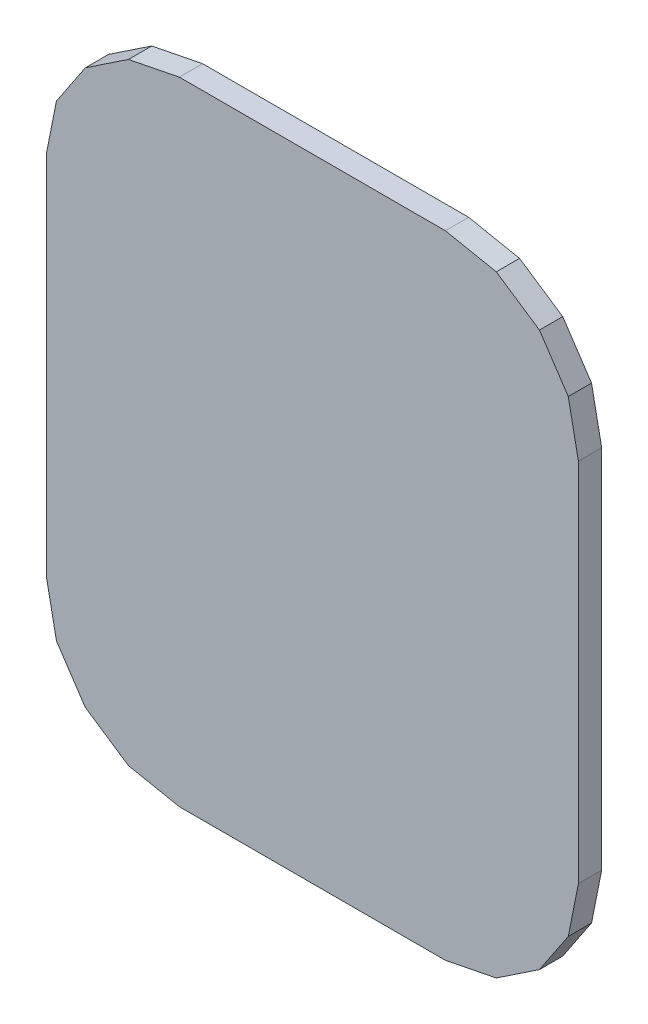
ISO-10303-21;
HEADER;
FILE_DESCRIPTION(('STEP AP214'),'2;1');
FILE_NAME('part.step','',(''),(''),'','','');
FILE_SCHEMA(('AUTOMOTIVE_DESIGN { 1 0 10303 214 1 1 1 1 }'));
ENDSEC;
DATA;
#1=APPLICATION_CONTEXT('core data for automotive mechanical design processes');
#2=APPLICATION_PROTOCOL_DEFINITION('international standard','automotive_design',2000,#1);
#3=PRODUCT_CONTEXT('',#1,'mechanical');
#4=PRODUCT('Part','Part','',(#3));
#5=PRODUCT_RELATED_PRODUCT_CATEGORY('part','',(#4));
#6=PRODUCT_DEFINITION_FORMATION('','',#4);
#7=PRODUCT_DEFINITION_CONTEXT('part definition',#1,'design');
#8=PRODUCT_DEFINITION('design','',#6,#7);
#9=PRODUCT_DEFINITION_SHAPE('','',#8);
#10=(LENGTH_UNIT() NAMED_UNIT(*) SI_UNIT(.MILLI.,.METRE.));
#11=(NAMED_UNIT(*) PLANE_ANGLE_UNIT() SI_UNIT($,.RADIAN.));
#12=(NAMED_UNIT(*) SI_UNIT($,.STERADIAN.) SOLID_ANGLE_UNIT());
#13=UNCERTAINTY_MEASURE_WITH_UNIT(LENGTH_MEASURE(1.E-05),#10,'distance_accuracy_value','');
#14=(GEOMETRIC_REPRESENTATION_CONTEXT(3) GLOBAL_UNCERTAINTY_ASSIGNED_CONTEXT((#13)) GLOBAL_UNIT_ASSIGNED_CONTEXT((#10,
#11,#12)) REPRESENTATION_CONTEXT('',''));
#15=CARTESIAN_POINT('',(0.,0.,0.));
#16=DIRECTION('',(0.,0.,1.));
#17=DIRECTION('',(1.,0.,0.));
#18=AXIS2_PLACEMENT_3D('',#15,#16,#17);
#19=CARTESIAN_POINT('',(96.805,-113.19,1.635));
#20=DIRECTION('',(0.,0.,-1.));
#21=DIRECTION('',(0.,-1.,0.));
#22=AXIS2_PLACEMENT_3D('',#19,#20,#21);
#23=PLANE('',#22);
#24=DIRECTION('',(0.980785662568049,-0.195088400734009,0.));
#25=VECTOR('',#24,1.);
#26=CARTESIAN_POINT('',(97.005,-112.715,1.635));
#27=LINE('',#26,#25);
#28=CARTESIAN_POINT('',(97.005,-112.715,1.635));
#29=VERTEX_POINT('',#28);
#30=CARTESIAN_POINT('',(97.081537,-112.730224,1.635));
#31=VERTEX_POINT('',#30);
#32=EDGE_CURVE('E25',#29,#31,#27,.T.);
#33=ORIENTED_EDGE('',*,*,#32,.F.);
#34=DIRECTION('',(1.,0.,0.));
#35=VECTOR('',#34,1.);
#36=CARTESIAN_POINT('',(96.605,-112.715,1.635));
#37=LINE('',#36,#35);
#38=CARTESIAN_POINT('',(96.605,-112.715,1.635));
#39=VERTEX_POINT('',#38);
#40=EDGE_CURVE('E239',#39,#29,#37,.T.);
#41=ORIENTED_EDGE('',*,*,#40,.F.);
#42=DIRECTION('',(0.980785662568049,0.195088400734009,0.));
#43=VECTOR('',#42,1.);
#44=CARTESIAN_POINT('',(96.528463,-112.730224,1.635));
#45=LINE('',#44,#43);
#46=CARTESIAN_POINT('',(96.528463,-112.730224,1.635));
#47=VERTEX_POINT('',#46);
#48=EDGE_CURVE('E262',#47,#39,#45,.T.);
#49=ORIENTED_EDGE('',*,*,#48,.F.);
#50=DIRECTION('',(0.83146430087319,0.555578182053127,0.));
#51=VECTOR('',#50,1.);
#52=CARTESIAN_POINT('',(96.463579,-112.773579,1.635));
#53=LINE('',#52,#51);
#54=CARTESIAN_POINT('',(96.463579,-112.773579,1.635));
#55=VERTEX_POINT('',#54);
#56=EDGE_CURVE('E280',#55,#47,#53,.T.);
#57=ORIENTED_EDGE('',*,*,#56,.F.);
#58=DIRECTION('',(0.555578182053127,0.83146430087319,0.));
#59=VECTOR('',#58,1.);
#60=CARTESIAN_POINT('',(96.420224,-112.838463,1.635));
#61=LINE('',#60,#59);
#62=CARTESIAN_POINT('',(96.420224,-112.838463,1.635));
#63=VERTEX_POINT('',#62);
#64=EDGE_CURVE('E330',#63,#55,#61,.T.);
#65=ORIENTED_EDGE('',*,*,#64,.F.);
#66=DIRECTION('',(0.195088400734009,0.980785662568049,0.));
#67=VECTOR('',#66,1.);
#68=CARTESIAN_POINT('',(96.405,-112.915,1.635));
#69=LINE('',#68,#67);
#70=CARTESIAN_POINT('',(96.405,-112.915,1.635));
#71=VERTEX_POINT('',#70);
#72=EDGE_CURVE('E321',#71,#63,#69,.T.);
#73=ORIENTED_EDGE('',*,*,#72,.F.);
#74=DIRECTION('',(0.,1.,0.));
#75=VECTOR('',#74,1.);
#76=CARTESIAN_POINT('',(96.405,-113.465,1.635));
#77=LINE('',#76,#75);
#78=CARTESIAN_POINT('',(96.405,-113.465,1.635));
#79=VERTEX_POINT('',#78);
#80=EDGE_CURVE('E309',#79,#71,#77,.T.);
#81=ORIENTED_EDGE('',*,*,#80,.F.);
#82=DIRECTION('',(-0.195088400734009,0.980785662568049,0.));
#83=VECTOR('',#82,1.);
#84=CARTESIAN_POINT('',(96.420224,-113.541537,1.635));
#85=LINE('',#84,#83);
#86=CARTESIAN_POINT('',(96.420224,-113.541537,1.635));
#87=VERTEX_POINT('',#86);
#88=EDGE_CURVE('E246',#87,#79,#85,.T.);
#89=ORIENTED_EDGE('',*,*,#88,.F.);
#90=DIRECTION('',(-0.555578182053127,0.83146430087319,0.));
#91=VECTOR('',#90,1.);
#92=CARTESIAN_POINT('',(96.463579,-113.606421,1.635));
#93=LINE('',#92,#91);
#94=CARTESIAN_POINT('',(96.463579,-113.606421,1.635));
#95=VERTEX_POINT('',#94);
#96=EDGE_CURVE('E294',#95,#87,#93,.T.);
#97=ORIENTED_EDGE('',*,*,#96,.F.);
#98=DIRECTION('',(-0.83146430087319,0.555578182053127,0.));
#99=VECTOR('',#98,1.);
#100=CARTESIAN_POINT('',(96.528463,-113.649776,1.635));
#101=LINE('',#100,#99);
#102=CARTESIAN_POINT('',(96.528463,-113.649776,1.635));
#103=VERTEX_POINT('',#102);
#104=EDGE_CURVE('E285',#103,#95,#101,.T.);
#105=ORIENTED_EDGE('',*,*,#104,.F.);
#106=DIRECTION('',(-0.980785662568049,0.195088400734009,0.));
#107=VECTOR('',#106,1.);
#108=CARTESIAN_POINT('',(96.605,-113.665,1.635));
#109=LINE('',#108,#107);
#110=CARTESIAN_POINT('',(96.605,-113.665,1.635));
#111=VERTEX_POINT('',#110);
#112=EDGE_CURVE('E257',#111,#103,#109,.T.);
#113=ORIENTED_EDGE('',*,*,#112,.F.);
#114=DIRECTION('',(-1.,0.,0.));
#115=VECTOR('',#114,1.);
#116=CARTESIAN_POINT('',(97.005,-113.665,1.635));
#117=LINE('',#116,#115);
#118=CARTESIAN_POINT('',(97.005,-113.665,1.635));
#119=VERTEX_POINT('',#118);
#120=EDGE_CURVE('E210',#119,#111,#117,.T.);
#121=ORIENTED_EDGE('',*,*,#120,.F.);
#122=DIRECTION('',(-0.980785662568049,-0.195088400734009,0.));
#123=VECTOR('',#122,1.);
#124=CARTESIAN_POINT('',(97.081537,-113.649776,1.635));
#125=LINE('',#124,#123);
#126=CARTESIAN_POINT('',(97.081537,-113.649776,1.635));
#127=VERTEX_POINT('',#126);
#128=EDGE_CURVE('E222',#127,#119,#125,.T.);
#129=ORIENTED_EDGE('',*,*,#128,.F.);
#130=DIRECTION('',(-0.83146430087319,-0.555578182053127,0.));
#131=VECTOR('',#130,1.);
#132=CARTESIAN_POINT('',(97.146421,-113.606421,1.635));
#133=LINE('',#132,#131);
#134=CARTESIAN_POINT('',(97.146421,-113.606421,1.635));
#135=VERTEX_POINT('',#134);
#136=EDGE_CURVE('E225',#135,#127,#133,.T.);
#137=ORIENTED_EDGE('',*,*,#136,.F.);
#138=DIRECTION('',(-0.555578182053127,-0.83146430087319,0.));
#139=VECTOR('',#138,1.);
#140=CARTESIAN_POINT('',(97.189776,-113.541537,1.635));
#141=LINE('',#140,#139);
#142=CARTESIAN_POINT('',(97.189776,-113.541537,1.635));
#143=VERTEX_POINT('',#142);
#144=EDGE_CURVE('E396',#143,#135,#141,.T.);
#145=ORIENTED_EDGE('',*,*,#144,.F.);
#146=DIRECTION('',(-0.195088400734009,-0.980785662568049,0.));
#147=VECTOR('',#146,1.);
#148=CARTESIAN_POINT('',(97.205,-113.465,1.635));
#149=LINE('',#148,#147);
#150=CARTESIAN_POINT('',(97.205,-113.465,1.635));
#151=VERTEX_POINT('',#150);
#152=EDGE_CURVE('E427',#151,#143,#149,.T.);
#153=ORIENTED_EDGE('',*,*,#152,.F.);
#154=DIRECTION('',(0.,-1.,0.));
#155=VECTOR('',#154,1.);
#156=CARTESIAN_POINT('',(97.205,-112.915,1.635));
#157=LINE('',#156,#155);
#158=CARTESIAN_POINT('',(97.205,-112.915,1.635));
#159=VERTEX_POINT('',#158);
#160=EDGE_CURVE('E388',#159,#151,#157,.T.);
#161=ORIENTED_EDGE('',*,*,#160,.F.);
#162=DIRECTION('',(0.195088400734009,-0.980785662568049,0.));
#163=VECTOR('',#162,1.);
#164=CARTESIAN_POINT('',(97.189776,-112.838463,1.635));
#165=LINE('',#164,#163);
#166=CARTESIAN_POINT('',(97.189776,-112.838463,1.635));
#167=VERTEX_POINT('',#166);
#168=EDGE_CURVE('E376',#167,#159,#165,.T.);
#169=ORIENTED_EDGE('',*,*,#168,.F.);
#170=DIRECTION('',(0.555578182053127,-0.83146430087319,0.));
#171=VECTOR('',#170,1.);
#172=CARTESIAN_POINT('',(97.146421,-112.773579,1.635));
#173=LINE('',#172,#171);
#174=CARTESIAN_POINT('',(97.146421,-112.773579,1.635));
#175=VERTEX_POINT('',#174);
#176=EDGE_CURVE('E476',#175,#167,#173,.T.);
#177=ORIENTED_EDGE('',*,*,#176,.F.);
#178=DIRECTION('',(0.83146430087319,-0.555578182053127,0.));
#179=VECTOR('',#178,1.);
#180=CARTESIAN_POINT('',(97.081537,-112.730224,1.635));
#181=LINE('',#180,#179);
#182=EDGE_CURVE('E492',#31,#175,#181,.T.);
#183=ORIENTED_EDGE('',*,*,#182,.F.);
#184=EDGE_LOOP('',(#33,#41,#49,#57,#65,#73,#81,#89,#97,#105,#113,#121,#129,#137,#145,#153,#161,
#169,#177,#183));
#185=FACE_BOUND('',#184,.T.);
#186=ADVANCED_FACE('F17',(#185),#23,.F.);
#187=CARTESIAN_POINT('',(96.805,-113.19,1.6));
#188=DIRECTION('',(0.,0.,-1.));
#189=DIRECTION('',(0.,-1.,0.));
#190=AXIS2_PLACEMENT_3D('',#187,#188,#189);
#191=PLANE('',#190);
#192=DIRECTION('',(0.83146430087319,-0.555578182053127,0.));
#193=VECTOR('',#192,1.);
#194=CARTESIAN_POINT('',(97.081537,-112.730224,1.6));
#195=LINE('',#194,#193);
#196=CARTESIAN_POINT('',(97.081537,-112.730224,1.6));
#197=VERTEX_POINT('',#196);
#198=CARTESIAN_POINT('',(97.146421,-112.773579,1.6));
#199=VERTEX_POINT('',#198);
#200=EDGE_CURVE('E481',#197,#199,#195,.T.);
#201=ORIENTED_EDGE('',*,*,#200,.T.);
#202=DIRECTION('',(0.555578182053127,-0.83146430087319,0.));
#203=VECTOR('',#202,1.);
#204=CARTESIAN_POINT('',(97.146421,-112.773579,1.6));
#205=LINE('',#204,#203);
#206=CARTESIAN_POINT('',(97.189776,-112.838463,1.6));
#207=VERTEX_POINT('',#206);
#208=EDGE_CURVE('E372',#199,#207,#205,.T.);
#209=ORIENTED_EDGE('',*,*,#208,.T.);
#210=DIRECTION('',(0.195088400734009,-0.980785662568049,0.));
#211=VECTOR('',#210,1.);
#212=CARTESIAN_POINT('',(97.189776,-112.838463,1.6));
#213=LINE('',#212,#211);
#214=CARTESIAN_POINT('',(97.205,-112.915,1.6));
#215=VERTEX_POINT('',#214);
#216=EDGE_CURVE('E367',#207,#215,#213,.T.);
#217=ORIENTED_EDGE('',*,*,#216,.T.);
#218=DIRECTION('',(0.,-1.,0.));
#219=VECTOR('',#218,1.);
#220=CARTESIAN_POINT('',(97.205,-112.915,1.6));
#221=LINE('',#220,#219);
#222=CARTESIAN_POINT('',(97.205,-113.465,1.6));
#223=VERTEX_POINT('',#222);
#224=EDGE_CURVE('E436',#215,#223,#221,.T.);
#225=ORIENTED_EDGE('',*,*,#224,.T.);
#226=DIRECTION('',(-0.195088400734009,-0.980785662568049,0.));
#227=VECTOR('',#226,1.);
#228=CARTESIAN_POINT('',(97.205,-113.465,1.6));
#229=LINE('',#228,#227);
#230=CARTESIAN_POINT('',(97.189776,-113.541537,1.6));
#231=VERTEX_POINT('',#230);
#232=EDGE_CURVE('E393',#223,#231,#229,.T.);
#233=ORIENTED_EDGE('',*,*,#232,.T.);
#234=DIRECTION('',(-0.555578182053127,-0.83146430087319,0.));
#235=VECTOR('',#234,1.);
#236=CARTESIAN_POINT('',(97.189776,-113.541537,1.6));
#237=LINE('',#236,#235);
#238=CARTESIAN_POINT('',(97.146421,-113.606421,1.6));
#239=VERTEX_POINT('',#238);
#240=EDGE_CURVE('E217',#231,#239,#237,.T.);
#241=ORIENTED_EDGE('',*,*,#240,.T.);
#242=DIRECTION('',(-0.83146430087319,-0.555578182053127,0.));
#243=VECTOR('',#242,1.);
#244=CARTESIAN_POINT('',(97.146421,-113.606421,1.6));
#245=LINE('',#244,#243);
#246=CARTESIAN_POINT('',(97.081537,-113.649776,1.6));
#247=VERTEX_POINT('',#246);
#248=EDGE_CURVE('E213',#239,#247,#245,.T.);
#249=ORIENTED_EDGE('',*,*,#248,.T.);
#250=DIRECTION('',(-0.980785662568049,-0.195088400734009,0.));
#251=VECTOR('',#250,1.);
#252=CARTESIAN_POINT('',(97.081537,-113.649776,1.6));
#253=LINE('',#252,#251);
#254=CARTESIAN_POINT('',(97.005,-113.665,1.6));
#255=VERTEX_POINT('',#254);
#256=EDGE_CURVE('E198',#247,#255,#253,.T.);
#257=ORIENTED_EDGE('',*,*,#256,.T.);
#258=DIRECTION('',(-1.,0.,0.));
#259=VECTOR('',#258,1.);
#260=CARTESIAN_POINT('',(97.005,-113.665,1.6));
#261=LINE('',#260,#259);
#262=CARTESIAN_POINT('',(96.605,-113.665,1.6));
#263=VERTEX_POINT('',#262);
#264=EDGE_CURVE('E270',#255,#263,#261,.T.);
#265=ORIENTED_EDGE('',*,*,#264,.T.);
#266=DIRECTION('',(-0.980785662568049,0.195088400734009,0.));
#267=VECTOR('',#266,1.);
#268=CARTESIAN_POINT('',(96.605,-113.665,1.6));
#269=LINE('',#268,#267);
#270=CARTESIAN_POINT('',(96.528463,-113.649776,1.6));
#271=VERTEX_POINT('',#270);
#272=EDGE_CURVE('E256',#263,#271,#269,.T.);
#273=ORIENTED_EDGE('',*,*,#272,.T.);
#274=DIRECTION('',(-0.83146430087319,0.555578182053127,0.));
#275=VECTOR('',#274,1.);
#276=CARTESIAN_POINT('',(96.528463,-113.649776,1.6));
#277=LINE('',#276,#275);
#278=CARTESIAN_POINT('',(96.463579,-113.606421,1.6));
#279=VERTEX_POINT('',#278);
#280=EDGE_CURVE('E290',#271,#279,#277,.T.);
#281=ORIENTED_EDGE('',*,*,#280,.T.);
#282=DIRECTION('',(-0.555578182053127,0.83146430087319,0.));
#283=VECTOR('',#282,1.);
#284=CARTESIAN_POINT('',(96.463579,-113.606421,1.6));
#285=LINE('',#284,#283);
#286=CARTESIAN_POINT('',(96.420224,-113.541537,1.6));
#287=VERTEX_POINT('',#286);
#288=EDGE_CURVE('E251',#279,#287,#285,.T.);
#289=ORIENTED_EDGE('',*,*,#288,.T.);
#290=DIRECTION('',(-0.195088400734009,0.980785662568049,0.));
#291=VECTOR('',#290,1.);
#292=CARTESIAN_POINT('',(96.420224,-113.541537,1.6));
#293=LINE('',#292,#291);
#294=CARTESIAN_POINT('',(96.405,-113.465,1.6));
#295=VERTEX_POINT('',#294);
#296=EDGE_CURVE('E305',#287,#295,#293,.T.);
#297=ORIENTED_EDGE('',*,*,#296,.T.);
#298=DIRECTION('',(0.,1.,0.));
#299=VECTOR('',#298,1.);
#300=CARTESIAN_POINT('',(96.405,-113.465,1.6));
#301=LINE('',#300,#299);
#302=CARTESIAN_POINT('',(96.405,-112.915,1.6));
#303=VERTEX_POINT('',#302);
#304=EDGE_CURVE('E317',#295,#303,#301,.T.);
#305=ORIENTED_EDGE('',*,*,#304,.T.);
#306=DIRECTION('',(0.195088400734009,0.980785662568049,0.));
#307=VECTOR('',#306,1.);
#308=CARTESIAN_POINT('',(96.405,-112.915,1.6));
#309=LINE('',#308,#307);
#310=CARTESIAN_POINT('',(96.420224,-112.838463,1.6));
#311=VERTEX_POINT('',#310);
#312=EDGE_CURVE('E326',#303,#311,#309,.T.);
#313=ORIENTED_EDGE('',*,*,#312,.T.);
#314=DIRECTION('',(0.555578182053127,0.83146430087319,0.));
#315=VECTOR('',#314,1.);
#316=CARTESIAN_POINT('',(96.420224,-112.838463,1.6));
#317=LINE('',#316,#315);
#318=CARTESIAN_POINT('',(96.463579,-112.773579,1.6));
#319=VERTEX_POINT('',#318);
#320=EDGE_CURVE('E276',#311,#319,#317,.T.);
#321=ORIENTED_EDGE('',*,*,#320,.T.);
#322=DIRECTION('',(0.83146430087319,0.555578182053127,0.));
#323=VECTOR('',#322,1.);
#324=CARTESIAN_POINT('',(96.463579,-112.773579,1.6));
#325=LINE('',#324,#323);
#326=CARTESIAN_POINT('',(96.528463,-112.730224,1.6));
#327=VERTEX_POINT('',#326);
#328=EDGE_CURVE('E266',#319,#327,#325,.T.);
#329=ORIENTED_EDGE('',*,*,#328,.T.);
#330=DIRECTION('',(0.980785662568049,0.195088400734009,0.));
#331=VECTOR('',#330,1.);
#332=CARTESIAN_POINT('',(96.528463,-112.730224,1.6));
#333=LINE('',#332,#331);
#334=CARTESIAN_POINT('',(96.605,-112.715,1.6));
#335=VERTEX_POINT('',#334);
#336=EDGE_CURVE('E236',#327,#335,#333,.T.);
#337=ORIENTED_EDGE('',*,*,#336,.T.);
#338=DIRECTION('',(1.,0.,0.));
#339=VECTOR('',#338,1.);
#340=CARTESIAN_POINT('',(96.605,-112.715,1.6));
#341=LINE('',#340,#339);
#342=CARTESIAN_POINT('',(97.005,-112.715,1.6));
#343=VERTEX_POINT('',#342);
#344=EDGE_CURVE('E349',#335,#343,#341,.T.);
#345=ORIENTED_EDGE('',*,*,#344,.T.);
#346=DIRECTION('',(0.980785662568049,-0.195088400734009,0.));
#347=VECTOR('',#346,1.);
#348=CARTESIAN_POINT('',(97.005,-112.715,1.6));
#349=LINE('',#348,#347);
#350=EDGE_CURVE('E11',#343,#197,#349,.T.);
#351=ORIENTED_EDGE('',*,*,#350,.T.);
#352=EDGE_LOOP('',(#201,#209,#217,#225,#233,#241,#249,#257,#265,#273,#281,#289,#297,#305,#313,
#321,#329,#337,#345,#351));
#353=FACE_BOUND('',#352,.T.);
#354=ADVANCED_FACE('F215',(#353),#191,.T.);
#355=CARTESIAN_POINT('',(97.005,-112.715,1.6));
#356=DIRECTION('',(0.195088400734009,0.980785662568049,0.));
#357=DIRECTION('',(0.,0.,-1.));
#358=AXIS2_PLACEMENT_3D('',#355,#356,#357);
#359=PLANE('',#358);
#360=DIRECTION('',(0.,0.,1.));
#361=VECTOR('',#360,1.);
#362=CARTESIAN_POINT('',(97.005,-112.715,1.6));
#363=LINE('',#362,#361);
#364=EDGE_CURVE('E235',#343,#29,#363,.T.);
#365=ORIENTED_EDGE('',*,*,#364,.T.);
#366=ORIENTED_EDGE('',*,*,#32,.T.);
#367=DIRECTION('',(0.,0.,1.));
#368=VECTOR('',#367,1.);
#369=CARTESIAN_POINT('',(97.081537,-112.730224,1.6));
#370=LINE('',#369,#368);
#371=EDGE_CURVE('E499',#197,#31,#370,.T.);
#372=ORIENTED_EDGE('',*,*,#371,.F.);
#373=ORIENTED_EDGE('',*,*,#350,.F.);
#374=EDGE_LOOP('',(#365,#366,#372,#373));
#375=FACE_BOUND('',#374,.T.);
#376=ADVANCED_FACE('F542',(#375),#359,.T.);
#377=CARTESIAN_POINT('',(96.605,-112.715,1.6));
#378=DIRECTION('',(0.,1.,0.));
#379=DIRECTION('',(1.,0.,0.));
#380=AXIS2_PLACEMENT_3D('',#377,#378,#379);
#381=PLANE('',#380);
#382=DIRECTION('',(0.,0.,1.));
#383=VECTOR('',#382,1.);
#384=CARTESIAN_POINT('',(96.605,-112.715,1.6));
#385=LINE('',#384,#383);
#386=EDGE_CURVE('E240',#335,#39,#385,.T.);
#387=ORIENTED_EDGE('',*,*,#386,.T.);
#388=ORIENTED_EDGE('',*,*,#40,.T.);
#389=ORIENTED_EDGE('',*,*,#364,.F.);
#390=ORIENTED_EDGE('',*,*,#344,.F.);
#391=EDGE_LOOP('',(#387,#388,#389,#390));
#392=FACE_BOUND('',#391,.T.);
#393=ADVANCED_FACE('F544',(#392),#381,.T.);
#394=CARTESIAN_POINT('',(96.528463,-112.730224,1.6));
#395=DIRECTION('',(-0.195088400734009,0.980785662568049,0.));
#396=DIRECTION('',(0.,0.,1.));
#397=AXIS2_PLACEMENT_3D('',#394,#395,#396);
#398=PLANE('',#397);
#399=DIRECTION('',(0.,0.,1.));
#400=VECTOR('',#399,1.);
#401=CARTESIAN_POINT('',(96.528463,-112.730224,1.6));
#402=LINE('',#401,#400);
#403=EDGE_CURVE('E340',#327,#47,#402,.T.);
#404=ORIENTED_EDGE('',*,*,#403,.T.);
#405=ORIENTED_EDGE('',*,*,#48,.T.);
#406=ORIENTED_EDGE('',*,*,#386,.F.);
#407=ORIENTED_EDGE('',*,*,#336,.F.);
#408=EDGE_LOOP('',(#404,#405,#406,#407));
#409=FACE_BOUND('',#408,.T.);
#410=ADVANCED_FACE('F552',(#409),#398,.T.);
#411=CARTESIAN_POINT('',(96.463579,-112.773579,1.6));
#412=DIRECTION('',(-0.555578182053127,0.83146430087319,0.));
#413=DIRECTION('',(0.,0.,1.));
#414=AXIS2_PLACEMENT_3D('',#411,#412,#413);
#415=PLANE('',#414);
#416=DIRECTION('',(0.,0.,1.));
#417=VECTOR('',#416,1.);
#418=CARTESIAN_POINT('',(96.463579,-112.773579,1.6));
#419=LINE('',#418,#417);
#420=EDGE_CURVE('E281',#319,#55,#419,.T.);
#421=ORIENTED_EDGE('',*,*,#420,.T.);
#422=ORIENTED_EDGE('',*,*,#56,.T.);
#423=ORIENTED_EDGE('',*,*,#403,.F.);
#424=ORIENTED_EDGE('',*,*,#328,.F.);
#425=EDGE_LOOP('',(#421,#422,#423,#424));
#426=FACE_BOUND('',#425,.T.);
#427=ADVANCED_FACE('F594',(#426),#415,.T.);
#428=CARTESIAN_POINT('',(96.420224,-112.838463,1.6));
#429=DIRECTION('',(-0.83146430087319,0.555578182053127,0.));
#430=DIRECTION('',(0.,0.,1.));
#431=AXIS2_PLACEMENT_3D('',#428,#429,#430);
#432=PLANE('',#431);
#433=DIRECTION('',(0.,0.,1.));
#434=VECTOR('',#433,1.);
#435=CARTESIAN_POINT('',(96.420224,-112.838463,1.6));
#436=LINE('',#435,#434);
#437=EDGE_CURVE('E325',#311,#63,#436,.T.);
#438=ORIENTED_EDGE('',*,*,#437,.T.);
#439=ORIENTED_EDGE('',*,*,#64,.T.);
#440=ORIENTED_EDGE('',*,*,#420,.F.);
#441=ORIENTED_EDGE('',*,*,#320,.F.);
#442=EDGE_LOOP('',(#438,#439,#440,#441));
#443=FACE_BOUND('',#442,.T.);
#444=ADVANCED_FACE('F601',(#443),#432,.T.);
#445=CARTESIAN_POINT('',(96.405,-112.915,1.6));
#446=DIRECTION('',(-0.980785662568049,0.195088400734009,0.));
#447=DIRECTION('',(0.,0.,1.));
#448=AXIS2_PLACEMENT_3D('',#445,#446,#447);
#449=PLANE('',#448);
#450=DIRECTION('',(0.,0.,1.));
#451=VECTOR('',#450,1.);
#452=CARTESIAN_POINT('',(96.405,-112.915,1.6));
#453=LINE('',#452,#451);
#454=EDGE_CURVE('E313',#303,#71,#453,.T.);
#455=ORIENTED_EDGE('',*,*,#454,.T.);
#456=ORIENTED_EDGE('',*,*,#72,.T.);
#457=ORIENTED_EDGE('',*,*,#437,.F.);
#458=ORIENTED_EDGE('',*,*,#312,.F.);
#459=EDGE_LOOP('',(#455,#456,#457,#458));
#460=FACE_BOUND('',#459,.T.);
#461=ADVANCED_FACE('F610',(#460),#449,.T.);
#462=CARTESIAN_POINT('',(96.405,-113.465,1.6));
#463=DIRECTION('',(-1.,0.,0.));
#464=DIRECTION('',(0.,0.,1.));
#465=AXIS2_PLACEMENT_3D('',#462,#463,#464);
#466=PLANE('',#465);
#467=DIRECTION('',(0.,0.,1.));
#468=VECTOR('',#467,1.);
#469=CARTESIAN_POINT('',(96.405,-113.465,1.6));
#470=LINE('',#469,#468);
#471=EDGE_CURVE('E250',#295,#79,#470,.T.);
#472=ORIENTED_EDGE('',*,*,#471,.T.);
#473=ORIENTED_EDGE('',*,*,#80,.T.);
#474=ORIENTED_EDGE('',*,*,#454,.F.);
#475=ORIENTED_EDGE('',*,*,#304,.F.);
#476=EDGE_LOOP('',(#472,#473,#474,#475));
#477=FACE_BOUND('',#476,.T.);
#478=ADVANCED_FACE('F625',(#477),#466,.T.);
#479=CARTESIAN_POINT('',(96.420224,-113.541537,1.6));
#480=DIRECTION('',(-0.980785662568049,-0.195088400734009,0.));
#481=DIRECTION('',(-0.195088400734009,0.980785662568049,0.));
#482=AXIS2_PLACEMENT_3D('',#479,#480,#481);
#483=PLANE('',#482);
#484=DIRECTION('',(0.,0.,1.));
#485=VECTOR('',#484,1.);
#486=CARTESIAN_POINT('',(96.420224,-113.541537,1.6));
#487=LINE('',#486,#485);
#488=EDGE_CURVE('E298',#287,#87,#487,.T.);
#489=ORIENTED_EDGE('',*,*,#488,.T.);
#490=ORIENTED_EDGE('',*,*,#88,.T.);
#491=ORIENTED_EDGE('',*,*,#471,.F.);
#492=ORIENTED_EDGE('',*,*,#296,.F.);
#493=EDGE_LOOP('',(#489,#490,#491,#492));
#494=FACE_BOUND('',#493,.T.);
#495=ADVANCED_FACE('F630',(#494),#483,.T.);
#496=CARTESIAN_POINT('',(96.463579,-113.606421,1.6));
#497=DIRECTION('',(-0.83146430087319,-0.555578182053127,0.));
#498=DIRECTION('',(-0.555578182053127,0.83146430087319,0.));
#499=AXIS2_PLACEMENT_3D('',#496,#497,#498);
#500=PLANE('',#499);
#501=DIRECTION('',(0.,0.,1.));
#502=VECTOR('',#501,1.);
#503=CARTESIAN_POINT('',(96.463579,-113.606421,1.6));
#504=LINE('',#503,#502);
#505=EDGE_CURVE('E286',#279,#95,#504,.T.);
#506=ORIENTED_EDGE('',*,*,#505,.T.);
#507=ORIENTED_EDGE('',*,*,#96,.T.);
#508=ORIENTED_EDGE('',*,*,#488,.F.);
#509=ORIENTED_EDGE('',*,*,#288,.F.);
#510=EDGE_LOOP('',(#506,#507,#508,#509));
#511=FACE_BOUND('',#510,.T.);
#512=ADVANCED_FACE('F520',(#511),#500,.T.);
#513=CARTESIAN_POINT('',(96.528463,-113.649776,1.6));
#514=DIRECTION('',(-0.555578182053127,-0.83146430087319,0.));
#515=DIRECTION('',(-0.83146430087319,0.555578182053127,0.));
#516=AXIS2_PLACEMENT_3D('',#513,#514,#515);
#517=PLANE('',#516);
#518=DIRECTION('',(0.,0.,1.));
#519=VECTOR('',#518,1.);
#520=CARTESIAN_POINT('',(96.528463,-113.649776,1.6));
#521=LINE('',#520,#519);
#522=EDGE_CURVE('E252',#271,#103,#521,.T.);
#523=ORIENTED_EDGE('',*,*,#522,.T.);
#524=ORIENTED_EDGE('',*,*,#104,.T.);
#525=ORIENTED_EDGE('',*,*,#505,.F.);
#526=ORIENTED_EDGE('',*,*,#280,.F.);
#527=EDGE_LOOP('',(#523,#524,#525,#526));
#528=FACE_BOUND('',#527,.T.);
#529=ADVANCED_FACE('F516',(#528),#517,.T.);
#530=CARTESIAN_POINT('',(96.605,-113.665,1.6));
#531=DIRECTION('',(-0.195088400734009,-0.980785662568049,0.));
#532=DIRECTION('',(-0.980785662568049,0.195088400734009,0.));
#533=AXIS2_PLACEMENT_3D('',#530,#531,#532);
#534=PLANE('',#533);
#535=DIRECTION('',(0.,0.,1.));
#536=VECTOR('',#535,1.);
#537=CARTESIAN_POINT('',(96.605,-113.665,1.6));
#538=LINE('',#537,#536);
#539=EDGE_CURVE('E261',#263,#111,#538,.T.);
#540=ORIENTED_EDGE('',*,*,#539,.T.);
#541=ORIENTED_EDGE('',*,*,#112,.T.);
#542=ORIENTED_EDGE('',*,*,#522,.F.);
#543=ORIENTED_EDGE('',*,*,#272,.F.);
#544=EDGE_LOOP('',(#540,#541,#542,#543));
#545=FACE_BOUND('',#544,.T.);
#546=ADVANCED_FACE('F523',(#545),#534,.T.);
#547=CARTESIAN_POINT('',(97.005,-113.665,1.6));
#548=DIRECTION('',(0.,-1.,0.));
#549=DIRECTION('',(0.,0.,-1.));
#550=AXIS2_PLACEMENT_3D('',#547,#548,#549);
#551=PLANE('',#550);
#552=DIRECTION('',(0.,0.,1.));
#553=VECTOR('',#552,1.);
#554=CARTESIAN_POINT('',(97.005,-113.665,1.6));
#555=LINE('',#554,#553);
#556=EDGE_CURVE('E206',#255,#119,#555,.T.);
#557=ORIENTED_EDGE('',*,*,#556,.T.);
#558=ORIENTED_EDGE('',*,*,#120,.T.);
#559=ORIENTED_EDGE('',*,*,#539,.F.);
#560=ORIENTED_EDGE('',*,*,#264,.F.);
#561=EDGE_LOOP('',(#557,#558,#559,#560));
#562=FACE_BOUND('',#561,.T.);
#563=ADVANCED_FACE('F525',(#562),#551,.T.);
#564=CARTESIAN_POINT('',(97.081537,-113.649776,1.6));
#565=DIRECTION('',(0.195088400734009,-0.980785662568049,0.));
#566=DIRECTION('',(0.,0.,-1.));
#567=AXIS2_PLACEMENT_3D('',#564,#565,#566);
#568=PLANE('',#567);
#569=DIRECTION('',(0.,0.,1.));
#570=VECTOR('',#569,1.);
#571=CARTESIAN_POINT('',(97.081537,-113.649776,1.6));
#572=LINE('',#571,#570);
#573=EDGE_CURVE('E203',#247,#127,#572,.T.);
#574=ORIENTED_EDGE('',*,*,#573,.T.);
#575=ORIENTED_EDGE('',*,*,#128,.T.);
#576=ORIENTED_EDGE('',*,*,#556,.F.);
#577=ORIENTED_EDGE('',*,*,#256,.F.);
#578=EDGE_LOOP('',(#574,#575,#576,#577));
#579=FACE_BOUND('',#578,.T.);
#580=ADVANCED_FACE('F200',(#579),#568,.T.);
#581=CARTESIAN_POINT('',(97.146421,-113.606421,1.6));
#582=DIRECTION('',(0.555578182053127,-0.83146430087319,0.));
#583=DIRECTION('',(0.,0.,-1.));
#584=AXIS2_PLACEMENT_3D('',#581,#582,#583);
#585=PLANE('',#584);
#586=DIRECTION('',(0.,0.,1.));
#587=VECTOR('',#586,1.);
#588=CARTESIAN_POINT('',(97.146421,-113.606421,1.6));
#589=LINE('',#588,#587);
#590=EDGE_CURVE('E401',#239,#135,#589,.T.);
#591=ORIENTED_EDGE('',*,*,#590,.T.);
#592=ORIENTED_EDGE('',*,*,#136,.T.);
#593=ORIENTED_EDGE('',*,*,#573,.F.);
#594=ORIENTED_EDGE('',*,*,#248,.F.);
#595=EDGE_LOOP('',(#591,#592,#593,#594));
#596=FACE_BOUND('',#595,.T.);
#597=ADVANCED_FACE('F224',(#596),#585,.T.);
#598=CARTESIAN_POINT('',(97.189776,-113.541537,1.6));
#599=DIRECTION('',(0.83146430087319,-0.555578182053127,0.));
#600=DIRECTION('',(0.,0.,-1.));
#601=AXIS2_PLACEMENT_3D('',#598,#599,#600);
#602=PLANE('',#601);
#603=DIRECTION('',(0.,0.,1.));
#604=VECTOR('',#603,1.);
#605=CARTESIAN_POINT('',(97.189776,-113.541537,1.6));
#606=LINE('',#605,#604);
#607=EDGE_CURVE('E397',#231,#143,#606,.T.);
#608=ORIENTED_EDGE('',*,*,#607,.T.);
#609=ORIENTED_EDGE('',*,*,#144,.T.);
#610=ORIENTED_EDGE('',*,*,#590,.F.);
#611=ORIENTED_EDGE('',*,*,#240,.F.);
#612=EDGE_LOOP('',(#608,#609,#610,#611));
#613=FACE_BOUND('',#612,.T.);
#614=ADVANCED_FACE('F527',(#613),#602,.T.);
#615=CARTESIAN_POINT('',(97.205,-113.465,1.6));
#616=DIRECTION('',(0.980785662568049,-0.195088400734009,0.));
#617=DIRECTION('',(0.,0.,-1.));
#618=AXIS2_PLACEMENT_3D('',#615,#616,#617);
#619=PLANE('',#618);
#620=DIRECTION('',(0.,0.,1.));
#621=VECTOR('',#620,1.);
#622=CARTESIAN_POINT('',(97.205,-113.465,1.6));
#623=LINE('',#622,#621);
#624=EDGE_CURVE('E392',#223,#151,#623,.T.);
#625=ORIENTED_EDGE('',*,*,#624,.T.);
#626=ORIENTED_EDGE('',*,*,#152,.T.);
#627=ORIENTED_EDGE('',*,*,#607,.F.);
#628=ORIENTED_EDGE('',*,*,#232,.F.);
#629=EDGE_LOOP('',(#625,#626,#627,#628));
#630=FACE_BOUND('',#629,.T.);
#631=ADVANCED_FACE('F530',(#630),#619,.T.);
#632=CARTESIAN_POINT('',(97.205,-112.915,1.6));
#633=DIRECTION('',(1.,0.,0.));
#634=DIRECTION('',(0.,1.,0.));
#635=AXIS2_PLACEMENT_3D('',#632,#633,#634);
#636=PLANE('',#635);
#637=DIRECTION('',(0.,0.,1.));
#638=VECTOR('',#637,1.);
#639=CARTESIAN_POINT('',(97.205,-112.915,1.6));
#640=LINE('',#639,#638);
#641=EDGE_CURVE('E381',#215,#159,#640,.T.);
#642=ORIENTED_EDGE('',*,*,#641,.T.);
#643=ORIENTED_EDGE('',*,*,#160,.T.);
#644=ORIENTED_EDGE('',*,*,#624,.F.);
#645=ORIENTED_EDGE('',*,*,#224,.F.);
#646=EDGE_LOOP('',(#642,#643,#644,#645));
#647=FACE_BOUND('',#646,.T.);
#648=ADVANCED_FACE('F534',(#647),#636,.T.);
#649=CARTESIAN_POINT('',(97.189776,-112.838463,1.6));
#650=DIRECTION('',(0.980785662568049,0.195088400734009,0.));
#651=DIRECTION('',(0.,0.,-1.));
#652=AXIS2_PLACEMENT_3D('',#649,#650,#651);
#653=PLANE('',#652);
#654=DIRECTION('',(0.,0.,1.));
#655=VECTOR('',#654,1.);
#656=CARTESIAN_POINT('',(97.189776,-112.838463,1.6));
#657=LINE('',#656,#655);
#658=EDGE_CURVE('E377',#207,#167,#657,.T.);
#659=ORIENTED_EDGE('',*,*,#658,.T.);
#660=ORIENTED_EDGE('',*,*,#168,.T.);
#661=ORIENTED_EDGE('',*,*,#641,.F.);
#662=ORIENTED_EDGE('',*,*,#216,.F.);
#663=EDGE_LOOP('',(#659,#660,#661,#662));
#664=FACE_BOUND('',#663,.T.);
#665=ADVANCED_FACE('F536',(#664),#653,.T.);
#666=CARTESIAN_POINT('',(97.146421,-112.773579,1.6));
#667=DIRECTION('',(0.83146430087319,0.555578182053127,0.));
#668=DIRECTION('',(0.,0.,-1.));
#669=AXIS2_PLACEMENT_3D('',#666,#667,#668);
#670=PLANE('',#669);
#671=DIRECTION('',(0.,0.,1.));
#672=VECTOR('',#671,1.);
#673=CARTESIAN_POINT('',(97.146421,-112.773579,1.6));
#674=LINE('',#673,#672);
#675=EDGE_CURVE('E486',#199,#175,#674,.T.);
#676=ORIENTED_EDGE('',*,*,#675,.T.);
#677=ORIENTED_EDGE('',*,*,#176,.T.);
#678=ORIENTED_EDGE('',*,*,#658,.F.);
#679=ORIENTED_EDGE('',*,*,#208,.F.);
#680=EDGE_LOOP('',(#676,#677,#678,#679));
#681=FACE_BOUND('',#680,.T.);
#682=ADVANCED_FACE('F539',(#681),#670,.T.);
#683=CARTESIAN_POINT('',(97.081537,-112.730224,1.6));
#684=DIRECTION('',(0.555578182053127,0.83146430087319,0.));
#685=DIRECTION('',(0.,0.,-1.));
#686=AXIS2_PLACEMENT_3D('',#683,#684,#685);
#687=PLANE('',#686);
#688=ORIENTED_EDGE('',*,*,#371,.T.);
#689=ORIENTED_EDGE('',*,*,#182,.T.);
#690=ORIENTED_EDGE('',*,*,#675,.F.);
#691=ORIENTED_EDGE('',*,*,#200,.F.);
#692=EDGE_LOOP('',(#688,#689,#690,#691));
#693=FACE_BOUND('',#692,.T.);
#694=ADVANCED_FACE('F541',(#693),#687,.T.);
#695=CLOSED_SHELL('',(#186,#354,#376,#393,#410,#427,#444,#461,#478,#495,#512,#529,#546,#563,
#580,#597,#614,#631,#648,#665,#682,#694));
#696=MANIFOLD_SOLID_BREP('B1',#695);
#697=ADVANCED_BREP_SHAPE_REPRESENTATION('',(#18,#696),#14);
#698=SHAPE_DEFINITION_REPRESENTATION(#9,#697);
ENDSEC;
END-ISO-10303-21;
